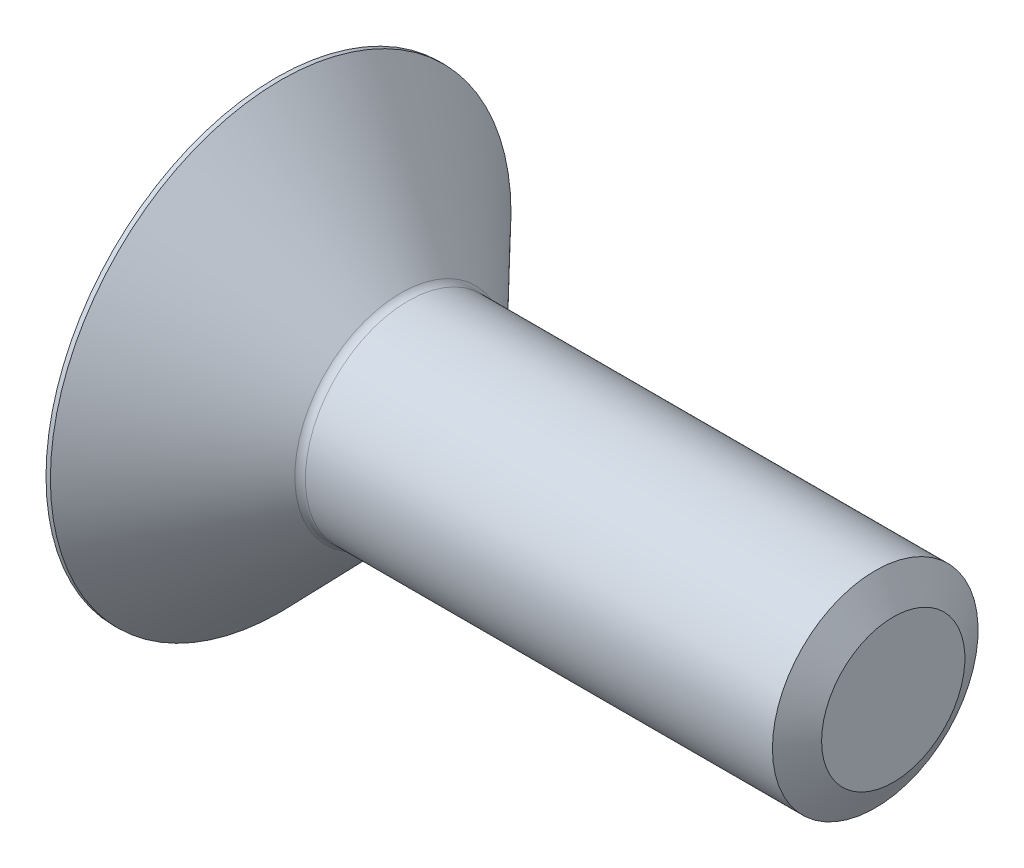
ISO-10303-21;
HEADER;
FILE_DESCRIPTION(('STEP AP214'),'2;1');
FILE_NAME('part.step','',(''),(''),'','','');
FILE_SCHEMA(('AUTOMOTIVE_DESIGN { 1 0 10303 214 1 1 1 1 }'));
ENDSEC;
DATA;
#1=APPLICATION_CONTEXT('core data for automotive mechanical design processes');
#2=APPLICATION_PROTOCOL_DEFINITION('international standard','automotive_design',2000,#1);
#3=PRODUCT_CONTEXT('',#1,'mechanical');
#4=PRODUCT('Part','Part','',(#3));
#5=PRODUCT_RELATED_PRODUCT_CATEGORY('part','',(#4));
#6=PRODUCT_DEFINITION_FORMATION('','',#4);
#7=PRODUCT_DEFINITION_CONTEXT('part definition',#1,'design');
#8=PRODUCT_DEFINITION('design','',#6,#7);
#9=PRODUCT_DEFINITION_SHAPE('','',#8);
#10=(LENGTH_UNIT() NAMED_UNIT(*) SI_UNIT(.MILLI.,.METRE.));
#11=(NAMED_UNIT(*) PLANE_ANGLE_UNIT() SI_UNIT($,.RADIAN.));
#12=(NAMED_UNIT(*) SI_UNIT($,.STERADIAN.) SOLID_ANGLE_UNIT());
#13=UNCERTAINTY_MEASURE_WITH_UNIT(LENGTH_MEASURE(1.E-05),#10,'distance_accuracy_value','');
#14=(GEOMETRIC_REPRESENTATION_CONTEXT(3) GLOBAL_UNCERTAINTY_ASSIGNED_CONTEXT((#13)) GLOBAL_UNIT_ASSIGNED_CONTEXT((#10,
#11,#12)) REPRESENTATION_CONTEXT('',''));
#15=CARTESIAN_POINT('',(0.,0.,0.));
#16=DIRECTION('',(0.,0.,1.));
#17=DIRECTION('',(1.,0.,0.));
#18=AXIS2_PLACEMENT_3D('',#15,#16,#17);
#19=CARTESIAN_POINT('',(0.,0.,0.));
#20=DIRECTION('',(1.,0.,0.));
#21=DIRECTION('',(0.,1.,0.));
#22=AXIS2_PLACEMENT_3D('',#19,#20,#21);
#23=CYLINDRICAL_SURFACE('',#22,2.);
#24=CARTESIAN_POINT('',(-9.43510503675808,0.,0.));
#25=DIRECTION('',(1.,0.,0.));
#26=DIRECTION('',(0.,1.,0.));
#27=AXIS2_PLACEMENT_3D('',#24,#25,#26);
#28=CIRCLE('',#27,2.);
#29=CARTESIAN_POINT('',(-9.43510503675808,2.,0.));
#30=VERTEX_POINT('',#29);
#31=EDGE_CURVE('E133',#30,#30,#28,.T.);
#32=ORIENTED_EDGE('',*,*,#31,.T.);
#33=EDGE_LOOP('',(#32));
#34=FACE_BOUND('',#33,.T.);
#35=CARTESIAN_POINT('',(-0.35,0.,0.));
#36=DIRECTION('',(-1.,0.,0.));
#37=DIRECTION('',(0.,0.,1.));
#38=AXIS2_PLACEMENT_3D('',#35,#36,#37);
#39=CIRCLE('',#38,2.);
#40=CARTESIAN_POINT('',(-0.35,0.,2.));
#41=VERTEX_POINT('',#40);
#42=EDGE_CURVE('E321',#41,#41,#39,.T.);
#43=ORIENTED_EDGE('',*,*,#42,.T.);
#44=EDGE_LOOP('',(#43));
#45=FACE_BOUND('',#44,.T.);
#46=ADVANCED_FACE('F46',(#34,#45),#23,.T.);
#47=CARTESIAN_POINT('',(-12.,4.48,0.));
#48=DIRECTION('',(-1.,0.,0.));
#49=DIRECTION('',(0.,-1.,0.));
#50=AXIS2_PLACEMENT_3D('',#47,#48,#49);
#51=PLANE('',#50);
#52=CARTESIAN_POINT('',(-12.,0.,0.));
#53=DIRECTION('',(1.,0.,0.));
#54=DIRECTION('',(0.,1.,0.));
#55=AXIS2_PLACEMENT_3D('',#52,#53,#54);
#56=CIRCLE('',#55,4.48);
#57=CARTESIAN_POINT('',(-12.,4.48,0.));
#58=VERTEX_POINT('',#57);
#59=EDGE_CURVE('E224',#58,#58,#56,.T.);
#60=ORIENTED_EDGE('',*,*,#59,.F.);
#61=EDGE_LOOP('',(#60));
#62=FACE_BOUND('',#61,.T.);
#63=CARTESIAN_POINT('',(-12.,0.,0.));
#64=DIRECTION('',(-1.,0.,0.));
#65=DIRECTION('',(0.,-1.,0.));
#66=AXIS2_PLACEMENT_3D('',#63,#64,#65);
#67=CIRCLE('',#66,1.44337567297406);
#68=CARTESIAN_POINT('',(-12.,-0.721687836487039,1.24999999999999));
#69=VERTEX_POINT('',#68);
#70=CARTESIAN_POINT('',(-12.,-1.44337567297406,0.));
#71=VERTEX_POINT('',#70);
#72=EDGE_CURVE('E50',#69,#71,#67,.F.);
#73=ORIENTED_EDGE('',*,*,#72,.T.);
#74=CARTESIAN_POINT('',(-12.,-0.721687836487038,-1.24999999999999));
#75=VERTEX_POINT('',#74);
#76=EDGE_CURVE('E11',#71,#75,#67,.F.);
#77=ORIENTED_EDGE('',*,*,#76,.T.);
#78=CARTESIAN_POINT('',(-12.,0.721687836487031,-1.25));
#79=VERTEX_POINT('',#78);
#80=EDGE_CURVE('E55',#75,#79,#67,.F.);
#81=ORIENTED_EDGE('',*,*,#80,.T.);
#82=CARTESIAN_POINT('',(-12.,1.44337567297406,0.));
#83=VERTEX_POINT('',#82);
#84=EDGE_CURVE('E120',#79,#83,#67,.F.);
#85=ORIENTED_EDGE('',*,*,#84,.T.);
#86=CARTESIAN_POINT('',(-12.,0.,0.));
#87=DIRECTION('',(-1.,0.,0.));
#88=DIRECTION('',(0.,0.,1.));
#89=AXIS2_PLACEMENT_3D('',#86,#87,#88);
#90=CIRCLE('',#89,1.44337567297406);
#91=CARTESIAN_POINT('',(-12.,0.721687836487035,1.25));
#92=VERTEX_POINT('',#91);
#93=EDGE_CURVE('E105',#92,#83,#90,.T.);
#94=ORIENTED_EDGE('',*,*,#93,.F.);
#95=EDGE_CURVE('E114',#92,#69,#67,.F.);
#96=ORIENTED_EDGE('',*,*,#95,.T.);
#97=EDGE_LOOP('',(#73,#77,#81,#85,#94,#96));
#98=FACE_BOUND('',#97,.T.);
#99=ADVANCED_FACE('F121',(#62,#98),#51,.T.);
#100=CARTESIAN_POINT('',(0.,0.,0.));
#101=DIRECTION('',(1.,0.,0.));
#102=DIRECTION('',(0.,1.,0.));
#103=AXIS2_PLACEMENT_3D('',#100,#101,#102);
#104=CYLINDRICAL_SURFACE('',#103,4.48);
#105=ORIENTED_EDGE('',*,*,#59,.T.);
#106=EDGE_LOOP('',(#105));
#107=FACE_BOUND('',#106,.T.);
#108=CARTESIAN_POINT('',(-11.9149081615215,0.,0.));
#109=DIRECTION('',(1.,0.,0.));
#110=DIRECTION('',(0.,1.,0.));
#111=AXIS2_PLACEMENT_3D('',#108,#109,#110);
#112=CIRCLE('',#111,4.48);
#113=CARTESIAN_POINT('',(-11.9149081615215,4.48,0.));
#114=VERTEX_POINT('',#113);
#115=EDGE_CURVE('E226',#114,#114,#112,.T.);
#116=ORIENTED_EDGE('',*,*,#115,.F.);
#117=EDGE_LOOP('',(#116));
#118=FACE_BOUND('',#117,.T.);
#119=ADVANCED_FACE('F212',(#107,#118),#104,.T.);
#120=CARTESIAN_POINT('',(-9.57897299682581,0.,0.));
#121=DIRECTION('',(-1.,0.,0.));
#122=DIRECTION('',(0.,-1.,0.));
#123=AXIS2_PLACEMENT_3D('',#120,#121,#122);
#124=CONICAL_SURFACE('',#123,2.0610683259082,0.802851455917393);
#125=ORIENTED_EDGE('',*,*,#115,.T.);
#126=EDGE_LOOP('',(#125));
#127=FACE_BOUND('',#126,.T.);
#128=CARTESIAN_POINT('',(-9.57897299682581,0.,0.));
#129=DIRECTION('',(1.,0.,0.));
#130=DIRECTION('',(0.,1.,0.));
#131=AXIS2_PLACEMENT_3D('',#128,#129,#130);
#132=CIRCLE('',#131,2.0610683259082);
#133=CARTESIAN_POINT('',(-9.57897299682581,2.0610683259082,0.));
#134=VERTEX_POINT('',#133);
#135=EDGE_CURVE('E230',#134,#134,#132,.T.);
#136=ORIENTED_EDGE('',*,*,#135,.F.);
#137=EDGE_LOOP('',(#136));
#138=FACE_BOUND('',#137,.T.);
#139=ADVANCED_FACE('F208',(#127,#138),#124,.T.);
#140=CARTESIAN_POINT('',(-9.43510503675808,0.,0.));
#141=DIRECTION('',(1.,0.,0.));
#142=DIRECTION('',(0.,1.,0.));
#143=AXIS2_PLACEMENT_3D('',#140,#141,#142);
#144=TOROIDAL_SURFACE('',#143,2.2,0.2);
#145=ORIENTED_EDGE('',*,*,#135,.T.);
#146=EDGE_LOOP('',(#145));
#147=FACE_BOUND('',#146,.T.);
#148=ORIENTED_EDGE('',*,*,#31,.F.);
#149=EDGE_LOOP('',(#148));
#150=FACE_BOUND('',#149,.T.);
#151=ADVANCED_FACE('F204',(#147,#150),#144,.F.);
#152=CARTESIAN_POINT('',(-11.63,0.,0.));
#153=DIRECTION('',(-1.,0.,0.));
#154=DIRECTION('',(0.,0.,1.));
#155=AXIS2_PLACEMENT_3D('',#152,#153,#154);
#156=CONICAL_SURFACE('',#155,0.,1.31985626102756);
#157=CARTESIAN_POINT('',(-12.0000296035517,-0.721572366433196,1.2502));
#158=CARTESIAN_POINT('',(-11.9923376245114,-0.751560236122212,1.19825948608787));
#159=CARTESIAN_POINT('',(-11.9853558988612,-0.781597955311095,1.14623263030924));
#160=CARTESIAN_POINT('',(-11.9730912390252,-0.841770545746217,1.04201064645257));
#161=CARTESIAN_POINT('',(-11.9678089341386,-0.871905448817343,0.989815463252219));
#162=CARTESIAN_POINT('',(-11.9592477971586,-0.932104975245321,0.885546824887376));
#163=CARTESIAN_POINT('',(-11.9559596086559,-0.962169257021961,0.833473961357168));
#164=CARTESIAN_POINT('',(-11.9515506008694,-1.0223329488635,0.729267390316703));
#165=CARTESIAN_POINT('',(-11.9504293994002,-1.05243235179703,0.677133695158351));
#166=CARTESIAN_POINT('',(-11.9504293994002,-1.11263115766407,0.572866304841648));
#167=CARTESIAN_POINT('',(-11.9515506008694,-1.1427305605976,0.520732609683296));
#168=CARTESIAN_POINT('',(-11.9559596086559,-1.20289425243914,0.416526038642831));
#169=CARTESIAN_POINT('',(-11.9592477971586,-1.23295853421578,0.364453175112623));
#170=CARTESIAN_POINT('',(-11.9678089341386,-1.29315806064376,0.26018453674778));
#171=CARTESIAN_POINT('',(-11.9730912390252,-1.32329296371488,0.207989353547427));
#172=CARTESIAN_POINT('',(-11.9853558988612,-1.38346555415,0.103767369690762));
#173=CARTESIAN_POINT('',(-11.9923376245114,-1.41350327333889,0.0517405139121311));
#174=CARTESIAN_POINT('',(-12.0000296035517,-1.4434911430279,-0.000200000000000636));
#175=B_SPLINE_CURVE_WITH_KNOTS('',3,(#157,#158,#159,#160,#161,#162,#163,#164,#165,#166,#167,
#168,#169,#170,#171,#172,#173,#174),.UNSPECIFIED.,.F.,.F.,(4,2,2,2,2,2,2,2,4),(0.,
0.181409592460798,0.362886284169927,0.543504761741732,0.724091381228727,0.904678000715721,
1.08529647828753,1.26677316999666,1.44818276245745),.UNSPECIFIED.);
#176=EDGE_CURVE('E139',#69,#71,#175,.T.);
#177=ORIENTED_EDGE('',*,*,#176,.T.);
#178=ORIENTED_EDGE('',*,*,#72,.F.);
#179=EDGE_LOOP('',(#177,#178));
#180=FACE_BOUND('',#179,.T.);
#181=ADVANCED_FACE('F207',(#180),#156,.F.);
#182=CARTESIAN_POINT('',(-12.2099346759608,-1.88564456120835,1.25));
#183=CARTESIAN_POINT('',(-12.1978717207745,-1.82917708754349,1.25));
#184=CARTESIAN_POINT('',(-12.1859628504096,-1.77267667269393,1.25));
#185=CARTESIAN_POINT('',(-12.1625309817601,-1.65959353764961,1.25));
#186=CARTESIAN_POINT('',(-12.1510079994722,-1.603010814144,1.25));
#187=CARTESIAN_POINT('',(-12.1171150456129,-1.43301680264336,1.25));
#188=CARTESIAN_POINT('',(-12.0954436732374,-1.31946408431674,1.25));
#189=CARTESIAN_POINT('',(-12.0550957638615,-1.09274070828191,1.25));
#190=CARTESIAN_POINT('',(-12.0363969731699,-0.979574090955366,1.25));
#191=CARTESIAN_POINT('',(-12.003262336561,-0.752620098792875,1.25));
#192=CARTESIAN_POINT('',(-11.9888257054665,-0.638832842230004,1.25));
#193=CARTESIAN_POINT('',(-11.9660896767951,-0.409425109562639,1.25));
#194=CARTESIAN_POINT('',(-11.9578544497048,-0.293797778272156,1.25));
#195=CARTESIAN_POINT('',(-11.9515679025367,-0.120164512833949,1.25));
#196=CARTESIAN_POINT('',(-11.9504831645204,-0.0622627928260231,1.25));
#197=CARTESIAN_POINT('',(-11.9503795328626,0.0535425644189861,1.25));
#198=CARTESIAN_POINT('',(-11.9513606413614,0.111446201657993,1.25));
#199=CARTESIAN_POINT('',(-11.9573598650352,0.285474295690509,1.25));
#200=CARTESIAN_POINT('',(-11.9654487463716,0.401498867422989,1.25));
#201=CARTESIAN_POINT('',(-11.9881044285232,0.632939913681974,1.25));
#202=CARTESIAN_POINT('',(-12.0026754362916,0.748355943957415,1.25));
#203=CARTESIAN_POINT('',(-12.0365518645555,0.980878548477109,1.25));
#204=CARTESIAN_POINT('',(-12.0559479394114,1.09797147883435,1.25));
#205=CARTESIAN_POINT('',(-12.0976947052346,1.33163516367125,1.25));
#206=CARTESIAN_POINT('',(-12.1200458280615,1.44820583924764,1.25));
#207=CARTESIAN_POINT('',(-12.1666691464839,1.68099121651053,1.25));
#208=CARTESIAN_POINT('',(-12.1909418646661,1.79720581237231,1.25));
#209=CARTESIAN_POINT('',(-12.2407644332383,2.02936144868274,1.25));
#210=CARTESIAN_POINT('',(-12.2663143094632,2.14530248354797,1.25));
#211=CARTESIAN_POINT('',(-12.3180065719477,2.37571314645443,1.25));
#212=CARTESIAN_POINT('',(-12.3441393559828,2.4901849375717,1.25));
#213=CARTESIAN_POINT('',(-12.3970181249437,2.71898894145419,1.25));
#214=CARTESIAN_POINT('',(-12.4237641225597,2.83332115127916,1.25));
#215=CARTESIAN_POINT('',(-12.4776683131006,3.06173187878166,1.25));
#216=CARTESIAN_POINT('',(-12.504825927525,3.17581053326541,1.25));
#217=CARTESIAN_POINT('',(-12.5594820608739,3.40388218756383,1.25));
#218=CARTESIAN_POINT('',(-12.5869805684218,3.51787519010305,1.25));
#219=CARTESIAN_POINT('',(-12.6145979060459,3.6318390658806,1.25));
#220=B_SPLINE_CURVE_WITH_KNOTS('',3,(#182,#183,#184,#185,#186,#187,#188,#189,#190,#191,#192,
#193,#194,#195,#196,#197,#198,#199,#200,#201,#202,#203,#204,#205,#206,#207,#208,#209,#210,#211,
#212,#213,#214,#215,#216,#217,#218,#219),.UNSPECIFIED.,.F.,.F.,(4,2,2,2,2,2,2,2,2,2,2,2,2,2,2,2,
2,2,4),(0.,0.173224299011892,0.346455770052937,0.693239171255751,1.03728991151599,
1.38127723097017,1.72877689620779,1.90247833758137,2.07617995891236,2.42483219762295,
2.77371104535804,3.12971850172323,3.48577804372492,3.84193475261371,4.19809866891608,
4.55034691732847,4.90260246198638,5.25440194267348,5.60618971410929),.UNSPECIFIED.);
#221=EDGE_CURVE('E110',#92,#69,#220,.F.);
#222=ORIENTED_EDGE('',*,*,#221,.T.);
#223=ORIENTED_EDGE('',*,*,#95,.F.);
#224=EDGE_LOOP('',(#222,#223));
#225=FACE_BOUND('',#224,.T.);
#226=ADVANCED_FACE('F115',(#225),#156,.F.);
#227=CARTESIAN_POINT('',(-12.0000296035517,1.4434911430279,-0.000199999999999889));
#228=CARTESIAN_POINT('',(-11.9923376245114,1.41350327333888,0.0517405139121313));
#229=CARTESIAN_POINT('',(-11.9853558988612,1.38346555415,0.103767369690762));
#230=CARTESIAN_POINT('',(-11.9730912390252,1.32329296371488,0.207989353547427));
#231=CARTESIAN_POINT('',(-11.9678089341386,1.29315806064375,0.260184536747781));
#232=CARTESIAN_POINT('',(-11.9592477971586,1.23295853421578,0.364453175112623));
#233=CARTESIAN_POINT('',(-11.9559596086559,1.20289425243914,0.416526038642832));
#234=CARTESIAN_POINT('',(-11.9515506008694,1.1427305605976,0.520732609683297));
#235=CARTESIAN_POINT('',(-11.9504293994002,1.11263115766407,0.572866304841648));
#236=CARTESIAN_POINT('',(-11.9504293994002,1.05243235179702,0.677133695158351));
#237=CARTESIAN_POINT('',(-11.9515506008694,1.0223329488635,0.729267390316703));
#238=CARTESIAN_POINT('',(-11.9559596086559,0.962169257021958,0.833473961357168));
#239=CARTESIAN_POINT('',(-11.9592477971586,0.932104975245318,0.885546824887376));
#240=CARTESIAN_POINT('',(-11.9678089341386,0.87190544881734,0.989815463252219));
#241=CARTESIAN_POINT('',(-11.9730912390252,0.841770545746214,1.04201064645257));
#242=CARTESIAN_POINT('',(-11.9853558988612,0.781597955311092,1.14623263030924));
#243=CARTESIAN_POINT('',(-11.9923376245114,0.75156023612221,1.19825948608787));
#244=CARTESIAN_POINT('',(-12.0000296035517,0.721572366433193,1.2502));
#245=B_SPLINE_CURVE_WITH_KNOTS('',3,(#227,#228,#229,#230,#231,#232,#233,#234,#235,#236,#237,
#238,#239,#240,#241,#242,#243,#244),.UNSPECIFIED.,.F.,.F.,(4,2,2,2,2,2,2,2,4),(0.,
0.181409592460797,0.362886284169927,0.543504761741732,0.724091381228726,0.904678000715721,
1.08529647828753,1.26677316999666,1.44818276245745),.UNSPECIFIED.);
#246=EDGE_CURVE('E101',#83,#92,#245,.T.);
#247=ORIENTED_EDGE('',*,*,#246,.T.);
#248=ORIENTED_EDGE('',*,*,#93,.T.);
#249=EDGE_LOOP('',(#247,#248));
#250=FACE_BOUND('',#249,.T.);
#251=ADVANCED_FACE('F103',(#250),#156,.F.);
#252=CARTESIAN_POINT('',(-12.0000296035517,0.721572366433193,-1.2502));
#253=CARTESIAN_POINT('',(-11.9923376245114,0.75156023612221,-1.19825948608787));
#254=CARTESIAN_POINT('',(-11.9853558988612,0.781597955311092,-1.14623263030924));
#255=CARTESIAN_POINT('',(-11.9730912390252,0.841770545746214,-1.04201064645257));
#256=CARTESIAN_POINT('',(-11.9678089341386,0.87190544881734,-0.989815463252219));
#257=CARTESIAN_POINT('',(-11.9592477971586,0.932104975245318,-0.885546824887376));
#258=CARTESIAN_POINT('',(-11.9559596086559,0.962169257021958,-0.833473961357168));
#259=CARTESIAN_POINT('',(-11.9515506008694,1.0223329488635,-0.729267390316703));
#260=CARTESIAN_POINT('',(-11.9504293994002,1.05243235179702,-0.677133695158352));
#261=CARTESIAN_POINT('',(-11.9504293994002,1.11263115766407,-0.572866304841648));
#262=CARTESIAN_POINT('',(-11.9515506008694,1.1427305605976,-0.520732609683297));
#263=CARTESIAN_POINT('',(-11.9559596086559,1.20289425243914,-0.416526038642832));
#264=CARTESIAN_POINT('',(-11.9592477971586,1.23295853421578,-0.364453175112624));
#265=CARTESIAN_POINT('',(-11.9678089341386,1.29315806064375,-0.260184536747781));
#266=CARTESIAN_POINT('',(-11.9730912390252,1.32329296371488,-0.207989353547427));
#267=CARTESIAN_POINT('',(-11.9853558988612,1.38346555415,-0.103767369690762));
#268=CARTESIAN_POINT('',(-11.9923376245114,1.41350327333888,-0.0517405139121312));
#269=CARTESIAN_POINT('',(-12.0000296035517,1.4434911430279,0.000200000000000081));
#270=B_SPLINE_CURVE_WITH_KNOTS('',3,(#252,#253,#254,#255,#256,#257,#258,#259,#260,#261,#262,
#263,#264,#265,#266,#267,#268,#269),.UNSPECIFIED.,.F.,.F.,(4,2,2,2,2,2,2,2,4),(0.,
0.181409592460797,0.362886284169927,0.543504761741732,0.724091381228727,0.904678000715721,
1.08529647828753,1.26677316999666,1.44818276245745),.UNSPECIFIED.);
#271=EDGE_CURVE('E123',#79,#83,#270,.T.);
#272=ORIENTED_EDGE('',*,*,#271,.T.);
#273=ORIENTED_EDGE('',*,*,#84,.F.);
#274=EDGE_LOOP('',(#272,#273));
#275=FACE_BOUND('',#274,.T.);
#276=ADVANCED_FACE('F304',(#275),#156,.F.);
#277=CARTESIAN_POINT('',(-12.2099346759325,-1.885644561076,-1.25));
#278=CARTESIAN_POINT('',(-12.1978717207476,-1.82917708741649,-1.25));
#279=CARTESIAN_POINT('',(-12.1859628503841,-1.7726766725723,-1.25));
#280=CARTESIAN_POINT('',(-12.1625309817374,-1.65959353753871,-1.25));
#281=CARTESIAN_POINT('',(-12.1510079994509,-1.60301081403847,-1.25));
#282=CARTESIAN_POINT('',(-12.1171150455956,-1.43301680255399,-1.25));
#283=CARTESIAN_POINT('',(-12.0954436732229,-1.31946408423816,-1.25));
#284=CARTESIAN_POINT('',(-12.0550957638519,-1.09274070822473,-1.25));
#285=CARTESIAN_POINT('',(-12.0363969731627,-0.97957409090879,-1.25));
#286=CARTESIAN_POINT('',(-12.0032623365578,-0.752620098767597,-1.25));
#287=CARTESIAN_POINT('',(-11.988825705465,-0.638832842215426,-1.25));
#288=CARTESIAN_POINT('',(-11.9660896767959,-0.409425109570647,-1.25));
#289=CARTESIAN_POINT('',(-11.9578544497063,-0.293797778292056,-1.25));
#290=CARTESIAN_POINT('',(-11.9515679025377,-0.120164512871692,-1.25));
#291=CARTESIAN_POINT('',(-11.950483164521,-0.0622627928697106,-1.25));
#292=CARTESIAN_POINT('',(-11.9503795328621,0.0535425643634282,-1.25));
#293=CARTESIAN_POINT('',(-11.9513606413601,0.11144620159651,-1.25));
#294=CARTESIAN_POINT('',(-11.9573598650309,0.285474295611227,-1.25));
#295=CARTESIAN_POINT('',(-11.9654487463646,0.401498867331896,-1.25));
#296=CARTESIAN_POINT('',(-11.9881044285101,0.632939913567422,-1.25));
#297=CARTESIAN_POINT('',(-12.0026754362751,0.748355943831214,-1.25));
#298=CARTESIAN_POINT('',(-12.0365518645336,0.980878548339565,-1.25));
#299=CARTESIAN_POINT('',(-12.0559479393881,1.09797147869704,-1.25));
#300=CARTESIAN_POINT('',(-12.097694705209,1.33163516353436,-1.25));
#301=CARTESIAN_POINT('',(-12.1200458280349,1.44820583911091,-1.25));
#302=CARTESIAN_POINT('',(-12.1666691464558,1.68099121637416,-1.25));
#303=CARTESIAN_POINT('',(-12.1909418646374,1.79720581223611,-1.25));
#304=CARTESIAN_POINT('',(-12.2407644332086,2.02936144854685,-1.25));
#305=CARTESIAN_POINT('',(-12.2663143094331,2.14530248341221,-1.25));
#306=CARTESIAN_POINT('',(-12.318006571917,2.37571314631909,-1.25));
#307=CARTESIAN_POINT('',(-12.3441393559518,2.49018493743663,-1.25));
#308=CARTESIAN_POINT('',(-12.3970181249123,2.71898894131965,-1.25));
#309=CARTESIAN_POINT('',(-12.4237641225282,2.83332115114489,-1.25));
#310=CARTESIAN_POINT('',(-12.4776683130688,3.06173187864781,-1.25));
#311=CARTESIAN_POINT('',(-12.5048259274931,3.17581053313172,-1.25));
#312=CARTESIAN_POINT('',(-12.5594820608418,3.40388218743046,-1.25));
#313=CARTESIAN_POINT('',(-12.5869805683896,3.51787518996983,-1.25));
#314=CARTESIAN_POINT('',(-12.6145979060137,3.63183906574753,-1.25));
#315=B_SPLINE_CURVE_WITH_KNOTS('',3,(#277,#278,#279,#280,#281,#282,#283,#284,#285,#286,#287,
#288,#289,#290,#291,#292,#293,#294,#295,#296,#297,#298,#299,#300,#301,#302,#303,#304,#305,#306,
#307,#308,#309,#310,#311,#312,#313,#314),.UNSPECIFIED.,.F.,.F.,(4,2,2,2,2,2,2,2,2,2,2,2,2,2,2,2,
2,2,4),(0.,0.173224298995286,0.346455770019722,0.693239171189212,1.03728991141696,
1.38127723083866,1.72877689604066,1.90247833739643,2.07617995870963,2.42483219738435,
2.77371104508349,3.12971850144865,3.48577804345034,3.84193475233927,4.19809866864177,
4.55034691705482,4.90260246171338,5.25440194240087,5.60618971383707),.UNSPECIFIED.);
#316=EDGE_CURVE('E260',#75,#79,#315,.T.);
#317=ORIENTED_EDGE('',*,*,#316,.T.);
#318=ORIENTED_EDGE('',*,*,#80,.F.);
#319=EDGE_LOOP('',(#317,#318));
#320=FACE_BOUND('',#319,.T.);
#321=ADVANCED_FACE('F292',(#320),#156,.F.);
#322=CARTESIAN_POINT('',(-12.0000296035517,-1.4434911430279,0.00019999999999943));
#323=CARTESIAN_POINT('',(-11.9923376245114,-1.41350327333889,-0.0517405139121319));
#324=CARTESIAN_POINT('',(-11.9853558988612,-1.38346555415,-0.103767369690763));
#325=CARTESIAN_POINT('',(-11.9730912390252,-1.32329296371488,-0.207989353547427));
#326=CARTESIAN_POINT('',(-11.9678089341386,-1.29315806064376,-0.260184536747781));
#327=CARTESIAN_POINT('',(-11.9592477971586,-1.23295853421578,-0.364453175112624));
#328=CARTESIAN_POINT('',(-11.9559596086559,-1.20289425243914,-0.416526038642832));
#329=CARTESIAN_POINT('',(-11.9515506008694,-1.1427305605976,-0.520732609683297));
#330=CARTESIAN_POINT('',(-11.9504293994002,-1.11263115766407,-0.572866304841649));
#331=CARTESIAN_POINT('',(-11.9504293994002,-1.05243235179703,-0.677133695158352));
#332=CARTESIAN_POINT('',(-11.9515506008694,-1.0223329488635,-0.729267390316703));
#333=CARTESIAN_POINT('',(-11.9559596086559,-0.962169257021961,-0.833473961357168));
#334=CARTESIAN_POINT('',(-11.9592477971586,-0.932104975245321,-0.885546824887376));
#335=CARTESIAN_POINT('',(-11.9678089341386,-0.871905448817343,-0.989815463252219));
#336=CARTESIAN_POINT('',(-11.9730912390252,-0.841770545746217,-1.04201064645257));
#337=CARTESIAN_POINT('',(-11.9853558988612,-0.781597955311095,-1.14623263030924));
#338=CARTESIAN_POINT('',(-11.9923376245114,-0.751560236122212,-1.19825948608787));
#339=CARTESIAN_POINT('',(-12.0000296035517,-0.721572366433196,-1.2502));
#340=B_SPLINE_CURVE_WITH_KNOTS('',3,(#322,#323,#324,#325,#326,#327,#328,#329,#330,#331,#332,
#333,#334,#335,#336,#337,#338,#339),.UNSPECIFIED.,.F.,.F.,(4,2,2,2,2,2,2,2,4),(0.,
0.181409592460797,0.362886284169926,0.543504761741732,0.724091381228726,0.90467800071572,
1.08529647828753,1.26677316999665,1.44818276245745),.UNSPECIFIED.);
#341=EDGE_CURVE('E141',#71,#75,#340,.T.);
#342=ORIENTED_EDGE('',*,*,#341,.T.);
#343=ORIENTED_EDGE('',*,*,#76,.F.);
#344=EDGE_LOOP('',(#342,#343));
#345=FACE_BOUND('',#344,.T.);
#346=ADVANCED_FACE('F294',(#345),#156,.F.);
#347=CARTESIAN_POINT('',(-10.5,0.,0.));
#348=DIRECTION('',(-1.,0.,0.));
#349=DIRECTION('',(0.,0.,1.));
#350=AXIS2_PLACEMENT_3D('',#347,#348,#349);
#351=CONICAL_SURFACE('',#350,1.44337567297406,1.0471975511966);
#352=CARTESIAN_POINT('',(-9.66666666666668,0.,0.));
#353=VERTEX_POINT('',#352);
#354=VERTEX_LOOP('',#353);
#355=FACE_BOUND('',#354,.T.);
#356=CARTESIAN_POINT('',(-10.9647941112469,-1.86893140246438,1.25));
#357=CARTESIAN_POINT('',(-10.9388968387752,-1.81495202331948,1.25));
#358=CARTESIAN_POINT('',(-10.913268622226,-1.76084125406821,1.25));
#359=CARTESIAN_POINT('',(-10.8627027608805,-1.65228662710084,1.25));
#360=CARTESIAN_POINT('',(-10.8377652403636,-1.59784271156478,1.25));
#361=CARTESIAN_POINT('',(-10.7885939165755,-1.48823931743727,1.25));
#362=CARTESIAN_POINT('',(-10.7643652996986,-1.43307750157608,1.25));
#363=CARTESIAN_POINT('',(-10.7169950706884,-1.322291884876,1.25));
#364=CARTESIAN_POINT('',(-10.6938534020354,-1.26666810823571,1.25));
#365=CARTESIAN_POINT('',(-10.6483546132115,-1.15340083084339,1.25));
#366=CARTESIAN_POINT('',(-10.6260338155954,-1.09574254299337,1.25));
#367=CARTESIAN_POINT('',(-10.5832554770157,-0.979741083181771,1.25));
#368=CARTESIAN_POINT('',(-10.5627981695306,-0.921397826430708,1.25));
#369=CARTESIAN_POINT('',(-10.5050842377309,-0.745435524961061,1.25));
#370=CARTESIAN_POINT('',(-10.47135021501,-0.626561938268991,1.25));
#371=CARTESIAN_POINT('',(-10.4322204068367,-0.445873083728397,1.25));
#372=CARTESIAN_POINT('',(-10.42109406062,-0.385304700204766,1.25));
#373=CARTESIAN_POINT('',(-10.4034278522596,-0.263486592005966,1.25));
#374=CARTESIAN_POINT('',(-10.3968876801734,-0.202236913658281,1.25));
#375=CARTESIAN_POINT('',(-10.3889987810357,-0.0801324467114857,1.25));
#376=CARTESIAN_POINT('',(-10.3875887912554,-0.0192817195873881,1.25));
#377=CARTESIAN_POINT('',(-10.389916187898,0.102319232972277,1.25));
#378=CARTESIAN_POINT('',(-10.3936538930481,0.163069451951552,1.25));
#379=CARTESIAN_POINT('',(-10.4088980280863,0.312961599284804,1.25));
#380=CARTESIAN_POINT('',(-10.4232612484972,0.401813056011363,1.25));
#381=CARTESIAN_POINT('',(-10.4602998496175,0.577788147007398,1.25));
#382=CARTESIAN_POINT('',(-10.4829852484746,0.664909564874818,1.25));
#383=CARTESIAN_POINT('',(-10.521737453429,0.795209225202643,1.25));
#384=CARTESIAN_POINT('',(-10.535622944966,0.839061002297504,1.25));
#385=CARTESIAN_POINT('',(-10.5646784155354,0.926308087978065,1.25));
#386=CARTESIAN_POINT('',(-10.5798475929484,0.969703662686594,1.25));
#387=CARTESIAN_POINT('',(-10.6112501341956,1.05609633562206,1.25));
#388=CARTESIAN_POINT('',(-10.6274833046304,1.09909350465343,1.25));
#389=CARTESIAN_POINT('',(-10.6608382441348,1.18474903966884,1.25));
#390=CARTESIAN_POINT('',(-10.6779601633366,1.22740734699801,1.25));
#391=CARTESIAN_POINT('',(-10.7227614294772,1.33629459608889,1.25));
#392=CARTESIAN_POINT('',(-10.7509693838226,1.40230581149779,1.25));
#393=CARTESIAN_POINT('',(-10.8087450814145,1.53373213651375,1.25));
#394=CARTESIAN_POINT('',(-10.8383129265288,1.59914720102263,1.25));
#395=CARTESIAN_POINT('',(-10.9285769202908,1.7946968045205,1.25));
#396=CARTESIAN_POINT('',(-10.990824273455,1.92411391038016,1.25));
#397=CARTESIAN_POINT('',(-11.1179296231775,2.18184246931719,1.25));
#398=CARTESIAN_POINT('',(-11.1827907350414,2.31015236758041,1.25));
#399=CARTESIAN_POINT('',(-11.31418074581,2.56589305739078,1.25));
#400=CARTESIAN_POINT('',(-11.3807094327218,2.69332395808158,1.25));
#401=CARTESIAN_POINT('',(-11.5085820019272,2.93557826354771,1.25));
#402=CARTESIAN_POINT('',(-11.5698225706953,3.05045639166053,1.25));
#403=CARTESIAN_POINT('',(-11.6930014803272,3.27984311951902,1.25));
#404=CARTESIAN_POINT('',(-11.7549398470138,3.39435170538628,1.25));
#405=CARTESIAN_POINT('',(-11.8791811563467,3.62279327925392,1.25));
#406=CARTESIAN_POINT('',(-11.9414827709679,3.7367269904863,1.25));
#407=CARTESIAN_POINT('',(-12.0664914922261,3.96436406683005,1.25));
#408=CARTESIAN_POINT('',(-12.1291985774721,4.07806744368399,1.25));
#409=CARTESIAN_POINT('',(-12.1920543496595,4.19168806666669,1.25));
#410=B_SPLINE_CURVE_WITH_KNOTS('',3,(#356,#357,#358,#359,#360,#361,#362,#363,#364,#365,#366,
#367,#368,#369,#370,#371,#372,#373,#374,#375,#376,#377,#378,#379,#380,#381,#382,#383,#384,#385,
#386,#387,#388,#389,#390,#391,#392,#393,#394,#395,#396,#397,#398,#399,#400,#401,#402,#403,#404,
#405,#406,#407,#408,#409),.UNSPECIFIED.,.F.,.F.,(4,2,2,2,2,2,2,2,2,2,2,2,2,2,2,2,2,2,2,2,2,2,2,
2,2,2,4),(0.,0.179612926792688,0.359257964740983,0.539992735858538,0.720718098634108,
0.906167782291709,1.09164066925558,1.46154014687423,1.64614554490065,1.83073846573361,
2.01311967500085,2.19551217717958,2.46497297803791,2.73475922301,2.87273702449913,
3.01062929039678,3.14849656109657,3.28638719734752,3.50172172684185,3.71707241315527,
4.14784491485955,4.57914698421607,5.01039449901239,5.40093821275166,5.79149642681542,
6.18106124320223,6.57060567267797),.UNSPECIFIED.);
#411=CARTESIAN_POINT('',(-10.5,-0.721687836487034,1.25));
#412=VERTEX_POINT('',#411);
#413=CARTESIAN_POINT('',(-10.5,0.721687836487031,1.25));
#414=VERTEX_POINT('',#413);
#415=EDGE_CURVE('E173',#412,#414,#410,.T.);
#416=ORIENTED_EDGE('',*,*,#415,.T.);
#417=CARTESIAN_POINT('',(-10.500066674666,0.721572366433193,1.2502));
#418=CARTESIAN_POINT('',(-10.4817459147637,0.753288124996229,1.19526669476823));
#419=CARTESIAN_POINT('',(-10.4650833062006,0.785277649221702,1.13985921349976));
#420=CARTESIAN_POINT('',(-10.4359973039458,0.849810733708402,1.02808463239966));
#421=CARTESIAN_POINT('',(-10.4235842019761,0.882355441401181,0.97171554515829));
#422=CARTESIAN_POINT('',(-10.404259687636,0.947041487997316,0.859676025913016));
#423=CARTESIAN_POINT('',(-10.3972196894474,0.979172868975892,0.804022841540771));
#424=CARTESIAN_POINT('',(-10.3888124326306,1.04358696985655,0.692454346091609));
#425=CARTESIAN_POINT('',(-10.3874382152047,1.07586945532687,0.6365394410624));
#426=CARTESIAN_POINT('',(-10.3902833373679,1.13620103554812,0.532042078818275));
#427=CARTESIAN_POINT('',(-10.39380409882,1.16425912049992,0.483444050118685));
#428=CARTESIAN_POINT('',(-10.4049671126993,1.22019247526559,0.386564637826762));
#429=CARTESIAN_POINT('',(-10.4126131855727,1.24806755133608,0.338283589807837));
#430=CARTESIAN_POINT('',(-10.4317294547005,1.30411641158755,0.241204116145958));
#431=CARTESIAN_POINT('',(-10.4432807569797,1.33228309485381,0.192417989648101));
#432=CARTESIAN_POINT('',(-10.4694983146939,1.38819614400745,0.0955737477078984));
#433=CARTESIAN_POINT('',(-10.4841584021391,1.41594322730596,0.047514389673036));
#434=CARTESIAN_POINT('',(-10.500066674666,1.4434911430279,-0.000199999999999954));
#435=B_SPLINE_CURVE_WITH_KNOTS('',3,(#417,#418,#419,#420,#421,#422,#423,#424,#425,#426,#427,
#428,#429,#430,#431,#432,#433,#434),.UNSPECIFIED.,.F.,.F.,(4,2,2,2,2,2,2,2,4),(0.,
0.198150821029559,0.396778196315221,0.590488617354399,0.783961049317181,0.952480056398646,
1.1211553973001,1.2935743034359,1.4656542697693),.UNSPECIFIED.);
#436=CARTESIAN_POINT('',(-10.5,1.44337567297406,0.));
#437=VERTEX_POINT('',#436);
#438=EDGE_CURVE('E130',#414,#437,#435,.T.);
#439=ORIENTED_EDGE('',*,*,#438,.T.);
#440=CARTESIAN_POINT('',(-10.500066674666,1.4434911430279,0.000200000000000111));
#441=CARTESIAN_POINT('',(-10.4817459147637,1.41177538446487,-0.0547333052317649));
#442=CARTESIAN_POINT('',(-10.4650833062006,1.37978586023939,-0.110140786500239));
#443=CARTESIAN_POINT('',(-10.4359973039458,1.31525277575269,-0.22191536760034));
#444=CARTESIAN_POINT('',(-10.4235842019761,1.28270806805991,-0.27828445484171));
#445=CARTESIAN_POINT('',(-10.404259687636,1.21802202146378,-0.390323974086984));
#446=CARTESIAN_POINT('',(-10.3972196894474,1.1858906404852,-0.445977158459229));
#447=CARTESIAN_POINT('',(-10.3888124326306,1.12147653960455,-0.557545653908391));
#448=CARTESIAN_POINT('',(-10.3874382152047,1.08919405413422,-0.6134605589376));
#449=CARTESIAN_POINT('',(-10.3902833373679,1.02886247391297,-0.717957921181725));
#450=CARTESIAN_POINT('',(-10.39380409882,1.00080438896118,-0.766555949881315));
#451=CARTESIAN_POINT('',(-10.4049671126993,0.944871034195502,-0.863435362173238));
#452=CARTESIAN_POINT('',(-10.4126131855727,0.916995958125019,-0.911716410192163));
#453=CARTESIAN_POINT('',(-10.4317294547005,0.860947097873545,-1.00879588385404));
#454=CARTESIAN_POINT('',(-10.4432807569797,0.832780414607289,-1.0575820103519));
#455=CARTESIAN_POINT('',(-10.4694983146939,0.776867365453647,-1.1544262522921));
#456=CARTESIAN_POINT('',(-10.4841584021391,0.749120282155139,-1.20248561032696));
#457=CARTESIAN_POINT('',(-10.500066674666,0.721572366433193,-1.2502));
#458=B_SPLINE_CURVE_WITH_KNOTS('',3,(#440,#441,#442,#443,#444,#445,#446,#447,#448,#449,#450,
#451,#452,#453,#454,#455,#456,#457),.UNSPECIFIED.,.F.,.F.,(4,2,2,2,2,2,2,2,4),(0.,
0.198150821029559,0.396778196315221,0.590488617354399,0.783961049317181,0.952480056398646,
1.1211553973001,1.2935743034359,1.4656542697693),.UNSPECIFIED.);
#459=CARTESIAN_POINT('',(-10.5,0.721687836487033,-1.25));
#460=VERTEX_POINT('',#459);
#461=EDGE_CURVE('E225',#437,#460,#458,.T.);
#462=ORIENTED_EDGE('',*,*,#461,.T.);
#463=CARTESIAN_POINT('',(-10.9647941109243,-1.86893140179217,-1.25));
#464=CARTESIAN_POINT('',(-10.9388968384665,-1.81495202267025,-1.25));
#465=CARTESIAN_POINT('',(-10.9132686219312,-1.76084125344197,-1.25));
#466=CARTESIAN_POINT('',(-10.8627027606134,-1.65228662652066,-1.25));
#467=CARTESIAN_POINT('',(-10.8377652401103,-1.59784271100767,-1.25));
#468=CARTESIAN_POINT('',(-10.7885939163498,-1.48823931692675,-1.25));
#469=CARTESIAN_POINT('',(-10.7643652994868,-1.43307750108907,-1.25));
#470=CARTESIAN_POINT('',(-10.7169950705039,-1.32229188443621,-1.25));
#471=CARTESIAN_POINT('',(-10.6938534018645,-1.26666810781962,-1.25));
#472=CARTESIAN_POINT('',(-10.6483546130678,-1.15340083047608,-1.25));
#473=CARTESIAN_POINT('',(-10.6260338154653,-1.09574254265115,-1.25));
#474=CARTESIAN_POINT('',(-10.583255476912,-0.979741082890175,-1.25));
#475=CARTESIAN_POINT('',(-10.5627981694397,-0.921397826164638,-1.25));
#476=CARTESIAN_POINT('',(-10.5050842376762,-0.74543552477224,-1.25));
#477=CARTESIAN_POINT('',(-10.4713502149769,-0.626561938132859,-1.25));
#478=CARTESIAN_POINT('',(-10.4322204068282,-0.445873083681238,-1.25));
#479=CARTESIAN_POINT('',(-10.4210940606189,-0.385304700192767,-1.25));
#480=CARTESIAN_POINT('',(-10.4034278522676,-0.26348659206503,-1.25));
#481=CARTESIAN_POINT('',(-10.3968876801832,-0.202236913753246,-1.25));
#482=CARTESIAN_POINT('',(-10.3889987810428,-0.0801324468775844,-1.25));
#483=CARTESIAN_POINT('',(-10.3875887912582,-0.0192817197887162,-1.25));
#484=CARTESIAN_POINT('',(-10.3899161878862,0.102319232701152,-1.25));
#485=CARTESIAN_POINT('',(-10.3936538930261,0.16306945164586,-1.25));
#486=CARTESIAN_POINT('',(-10.4088980280361,0.312961598922924,-1.25));
#487=CARTESIAN_POINT('',(-10.4232612484297,0.40181305562826,-1.25));
#488=CARTESIAN_POINT('',(-10.4602998495149,0.577788146583199,-1.25));
#489=CARTESIAN_POINT('',(-10.4829852483542,0.66490956443075,-1.25));
#490=CARTESIAN_POINT('',(-10.5217374532821,0.795209224728794,-1.25));
#491=CARTESIAN_POINT('',(-10.5356229448103,0.839061001813536,-1.25));
#492=CARTESIAN_POINT('',(-10.5646784153621,0.926308087473956,-1.25));
#493=CARTESIAN_POINT('',(-10.5798475927664,0.969703662172462,-1.25));
#494=CARTESIAN_POINT('',(-10.6112501339966,1.05609633508794,-1.25));
#495=CARTESIAN_POINT('',(-10.627483304423,1.09909350410934,-1.25));
#496=CARTESIAN_POINT('',(-10.6608382439108,1.1847490391048,-1.25));
#497=CARTESIAN_POINT('',(-10.6779601631043,1.22740734642399,-1.25));
#498=CARTESIAN_POINT('',(-10.7227614292321,1.33629459550825,-1.25));
#499=CARTESIAN_POINT('',(-10.7509693835735,1.40230581092029,-1.25));
#500=CARTESIAN_POINT('',(-10.8087450811585,1.53373213594212,-1.25));
#501=CARTESIAN_POINT('',(-10.8383129262699,1.59914720045375,-1.25));
#502=CARTESIAN_POINT('',(-10.9285769200244,1.79469680395943,-1.25));
#503=CARTESIAN_POINT('',(-10.9908242731852,1.92411390982369,-1.25));
#504=CARTESIAN_POINT('',(-11.1179296229027,2.18184246876937,-1.25));
#505=CARTESIAN_POINT('',(-11.182790734765,2.31015236703662,-1.25));
#506=CARTESIAN_POINT('',(-11.3141807455314,2.56589305685455,-1.25));
#507=CARTESIAN_POINT('',(-11.3807094324427,2.69332395754888,-1.25));
#508=CARTESIAN_POINT('',(-11.5085820016458,2.93557826301822,-1.25));
#509=CARTESIAN_POINT('',(-11.5698225704122,3.05045639113076,-1.25));
#510=CARTESIAN_POINT('',(-11.6930014800409,3.27984311898855,-1.25));
#511=CARTESIAN_POINT('',(-11.7549398467261,3.39435170485538,-1.25));
#512=CARTESIAN_POINT('',(-11.8791811560561,3.62279327872168,-1.25));
#513=CARTESIAN_POINT('',(-11.941482770676,3.73672698995313,-1.25));
#514=CARTESIAN_POINT('',(-12.0664914919315,3.96436406629495,-1.25));
#515=CARTESIAN_POINT('',(-12.1291985771761,4.07806744314788,-1.25));
#516=CARTESIAN_POINT('',(-12.1920543493623,4.19168806612954,-1.25));
#517=B_SPLINE_CURVE_WITH_KNOTS('',3,(#463,#464,#465,#466,#467,#468,#469,#470,#471,#472,#473,
#474,#475,#476,#477,#478,#479,#480,#481,#482,#483,#484,#485,#486,#487,#488,#489,#490,#491,#492,
#493,#494,#495,#496,#497,#498,#499,#500,#501,#502,#503,#504,#505,#506,#507,#508,#509,#510,#511,
#512,#513,#514,#515,#516),.UNSPECIFIED.,.F.,.F.,(4,2,2,2,2,2,2,2,2,2,2,2,2,2,2,2,2,2,2,2,2,2,2,
2,2,2,4),(0.,0.179612926712517,0.359257964580628,0.539992735616913,0.720718098311219,
0.906167781883883,1.09164066876279,1.46154014621251,1.64614554413148,1.83073846485713,
2.01311967401941,2.19551217609308,2.46497297688036,2.73475922178118,2.8727370232333,
3.01062928909398,3.14849655975688,3.2863871959709,3.5017217254691,3.71707241178641,
4.14784491349866,4.57914698286383,5.0103944976687,5.40093821140479,5.7914964254654,
6.18106124184772,6.57060567131894),.UNSPECIFIED.);
#518=CARTESIAN_POINT('',(-10.5,-0.721687836487033,-1.25));
#519=VERTEX_POINT('',#518);
#520=EDGE_CURVE('E109',#460,#519,#517,.F.);
#521=ORIENTED_EDGE('',*,*,#520,.T.);
#522=CARTESIAN_POINT('',(-10.500066674666,-0.721572366433196,-1.2502));
#523=CARTESIAN_POINT('',(-10.4817459147637,-0.753288124996231,-1.19526669476823));
#524=CARTESIAN_POINT('',(-10.4650833062006,-0.785277649221704,-1.13985921349976));
#525=CARTESIAN_POINT('',(-10.4359973039458,-0.849810733708404,-1.02808463239966));
#526=CARTESIAN_POINT('',(-10.4235842019761,-0.882355441401183,-0.97171554515829));
#527=CARTESIAN_POINT('',(-10.404259687636,-0.947041487997318,-0.859676025913016));
#528=CARTESIAN_POINT('',(-10.3972196894474,-0.979172868975894,-0.804022841540771));
#529=CARTESIAN_POINT('',(-10.3888124326306,-1.04358696985655,-0.692454346091609));
#530=CARTESIAN_POINT('',(-10.3874382152047,-1.07586945532687,-0.6365394410624));
#531=CARTESIAN_POINT('',(-10.3902833373679,-1.13620103554813,-0.532042078818275));
#532=CARTESIAN_POINT('',(-10.39380409882,-1.16425912049992,-0.483444050118685));
#533=CARTESIAN_POINT('',(-10.4049671126993,-1.22019247526559,-0.386564637826762));
#534=CARTESIAN_POINT('',(-10.4126131855727,-1.24806755133608,-0.338283589807837));
#535=CARTESIAN_POINT('',(-10.4317294547005,-1.30411641158755,-0.241204116145958));
#536=CARTESIAN_POINT('',(-10.4432807569797,-1.33228309485381,-0.192417989648101));
#537=CARTESIAN_POINT('',(-10.4694983146939,-1.38819614400745,-0.0955737477078988));
#538=CARTESIAN_POINT('',(-10.4841584021391,-1.41594322730596,-0.0475143896730367));
#539=CARTESIAN_POINT('',(-10.500066674666,-1.4434911430279,0.000199999999999313));
#540=B_SPLINE_CURVE_WITH_KNOTS('',3,(#522,#523,#524,#525,#526,#527,#528,#529,#530,#531,#532,
#533,#534,#535,#536,#537,#538,#539),.UNSPECIFIED.,.F.,.F.,(4,2,2,2,2,2,2,2,4),(0.,
0.198150821029559,0.39677819631522,0.590488617354399,0.783961049317181,0.952480056398645,
1.1211553973001,1.2935743034359,1.4656542697693),.UNSPECIFIED.);
#541=CARTESIAN_POINT('',(-10.5,-1.44337567297407,0.));
#542=VERTEX_POINT('',#541);
#543=EDGE_CURVE('E277',#519,#542,#540,.T.);
#544=ORIENTED_EDGE('',*,*,#543,.T.);
#545=CARTESIAN_POINT('',(-10.500066674666,-1.4434911430279,-0.00020000000000057));
#546=CARTESIAN_POINT('',(-10.4817459147637,-1.41177538446487,0.0547333052317647));
#547=CARTESIAN_POINT('',(-10.4650833062006,-1.3797858602394,0.110140786500239));
#548=CARTESIAN_POINT('',(-10.4359973039458,-1.31525277575269,0.221915367600339));
#549=CARTESIAN_POINT('',(-10.4235842019761,-1.28270806805992,0.27828445484171));
#550=CARTESIAN_POINT('',(-10.404259687636,-1.21802202146378,0.390323974086984));
#551=CARTESIAN_POINT('',(-10.3972196894474,-1.18589064048521,0.445977158459229));
#552=CARTESIAN_POINT('',(-10.3888124326306,-1.12147653960455,0.557545653908391));
#553=CARTESIAN_POINT('',(-10.3874382152047,-1.08919405413422,0.6134605589376));
#554=CARTESIAN_POINT('',(-10.3902833373679,-1.02886247391297,0.717957921181724));
#555=CARTESIAN_POINT('',(-10.39380409882,-1.00080438896118,0.766555949881315));
#556=CARTESIAN_POINT('',(-10.4049671126993,-0.944871034195505,0.863435362173238));
#557=CARTESIAN_POINT('',(-10.4126131855727,-0.916995958125021,0.911716410192163));
#558=CARTESIAN_POINT('',(-10.4317294547005,-0.860947097873548,1.00879588385404));
#559=CARTESIAN_POINT('',(-10.4432807569797,-0.832780414607291,1.0575820103519));
#560=CARTESIAN_POINT('',(-10.4694983146939,-0.77686736545365,1.1544262522921));
#561=CARTESIAN_POINT('',(-10.4841584021391,-0.749120282155142,1.20248561032696));
#562=CARTESIAN_POINT('',(-10.500066674666,-0.721572366433196,1.2502));
#563=B_SPLINE_CURVE_WITH_KNOTS('',3,(#545,#546,#547,#548,#549,#550,#551,#552,#553,#554,#555,
#556,#557,#558,#559,#560,#561,#562),.UNSPECIFIED.,.F.,.F.,(4,2,2,2,2,2,2,2,4),(0.,
0.198150821029559,0.39677819631522,0.590488617354399,0.783961049317181,0.952480056398646,
1.1211553973001,1.2935743034359,1.4656542697693),.UNSPECIFIED.);
#564=EDGE_CURVE('E180',#542,#412,#563,.T.);
#565=ORIENTED_EDGE('',*,*,#564,.T.);
#566=EDGE_LOOP('',(#416,#439,#462,#521,#544,#565));
#567=FACE_BOUND('',#566,.T.);
#568=ADVANCED_FACE('F167',(#355,#567),#351,.F.);
#569=CARTESIAN_POINT('',(-9.52,1.44337567297406,0.));
#570=DIRECTION('',(0.,0.866025403784439,-0.5));
#571=DIRECTION('',(0.,0.5,0.866025403784439));
#572=AXIS2_PLACEMENT_3D('',#569,#570,#571);
#573=PLANE('',#572);
#574=ORIENTED_EDGE('',*,*,#271,.F.);
#575=DIRECTION('',(-1.,0.,0.));
#576=VECTOR('',#575,1.);
#577=CARTESIAN_POINT('',(-9.52,0.721687836487031,-1.25));
#578=LINE('',#577,#576);
#579=EDGE_CURVE('E243',#460,#79,#578,.T.);
#580=ORIENTED_EDGE('',*,*,#579,.F.);
#581=ORIENTED_EDGE('',*,*,#461,.F.);
#582=DIRECTION('',(-1.,0.,0.));
#583=VECTOR('',#582,1.);
#584=CARTESIAN_POINT('',(-9.52,1.44337567297406,0.));
#585=LINE('',#584,#583);
#586=EDGE_CURVE('E190',#437,#83,#585,.T.);
#587=ORIENTED_EDGE('',*,*,#586,.T.);
#588=EDGE_LOOP('',(#574,#580,#581,#587));
#589=FACE_BOUND('',#588,.T.);
#590=ADVANCED_FACE('F197',(#589),#573,.F.);
#591=CARTESIAN_POINT('',(-9.52,0.721687836487031,-1.25));
#592=DIRECTION('',(0.,0.,-1.));
#593=DIRECTION('',(0.,1.,0.));
#594=AXIS2_PLACEMENT_3D('',#591,#592,#593);
#595=PLANE('',#594);
#596=ORIENTED_EDGE('',*,*,#316,.F.);
#597=DIRECTION('',(-1.,0.,0.));
#598=VECTOR('',#597,1.);
#599=CARTESIAN_POINT('',(-9.52,-0.721687836487033,-1.25));
#600=LINE('',#599,#598);
#601=EDGE_CURVE('E246',#519,#75,#600,.T.);
#602=ORIENTED_EDGE('',*,*,#601,.F.);
#603=ORIENTED_EDGE('',*,*,#520,.F.);
#604=ORIENTED_EDGE('',*,*,#579,.T.);
#605=EDGE_LOOP('',(#596,#602,#603,#604));
#606=FACE_BOUND('',#605,.T.);
#607=ADVANCED_FACE('F274',(#606),#595,.F.);
#608=CARTESIAN_POINT('',(-9.52,-0.721687836487033,-1.25));
#609=DIRECTION('',(0.,-0.866025403784439,-0.5));
#610=DIRECTION('',(0.,0.5,-0.866025403784439));
#611=AXIS2_PLACEMENT_3D('',#608,#609,#610);
#612=PLANE('',#611);
#613=ORIENTED_EDGE('',*,*,#341,.F.);
#614=DIRECTION('',(-1.,0.,0.));
#615=VECTOR('',#614,1.);
#616=CARTESIAN_POINT('',(-9.52,-1.44337567297407,0.));
#617=LINE('',#616,#615);
#618=EDGE_CURVE('E249',#542,#71,#617,.T.);
#619=ORIENTED_EDGE('',*,*,#618,.F.);
#620=ORIENTED_EDGE('',*,*,#543,.F.);
#621=ORIENTED_EDGE('',*,*,#601,.T.);
#622=EDGE_LOOP('',(#613,#619,#620,#621));
#623=FACE_BOUND('',#622,.T.);
#624=ADVANCED_FACE('F257',(#623),#612,.F.);
#625=CARTESIAN_POINT('',(-9.52,-1.44337567297407,0.));
#626=DIRECTION('',(0.,-0.866025403784439,0.5));
#627=DIRECTION('',(0.,-0.5,-0.866025403784439));
#628=AXIS2_PLACEMENT_3D('',#625,#626,#627);
#629=PLANE('',#628);
#630=ORIENTED_EDGE('',*,*,#176,.F.);
#631=DIRECTION('',(-1.,0.,0.));
#632=VECTOR('',#631,1.);
#633=CARTESIAN_POINT('',(-9.52,-0.721687836487033,1.25));
#634=LINE('',#633,#632);
#635=EDGE_CURVE('E134',#412,#69,#634,.T.);
#636=ORIENTED_EDGE('',*,*,#635,.F.);
#637=ORIENTED_EDGE('',*,*,#564,.F.);
#638=ORIENTED_EDGE('',*,*,#618,.T.);
#639=EDGE_LOOP('',(#630,#636,#637,#638));
#640=FACE_BOUND('',#639,.T.);
#641=ADVANCED_FACE('F166',(#640),#629,.F.);
#642=CARTESIAN_POINT('',(-9.52,-0.721687836487033,1.25));
#643=DIRECTION('',(0.,0.,1.));
#644=DIRECTION('',(0.,-1.,0.));
#645=AXIS2_PLACEMENT_3D('',#642,#643,#644);
#646=PLANE('',#645);
#647=ORIENTED_EDGE('',*,*,#221,.F.);
#648=DIRECTION('',(-1.,0.,0.));
#649=VECTOR('',#648,1.);
#650=CARTESIAN_POINT('',(-9.52,0.721687836487031,1.25));
#651=LINE('',#650,#649);
#652=EDGE_CURVE('E127',#414,#92,#651,.T.);
#653=ORIENTED_EDGE('',*,*,#652,.F.);
#654=ORIENTED_EDGE('',*,*,#415,.F.);
#655=ORIENTED_EDGE('',*,*,#635,.T.);
#656=EDGE_LOOP('',(#647,#653,#654,#655));
#657=FACE_BOUND('',#656,.T.);
#658=ADVANCED_FACE('F136',(#657),#646,.F.);
#659=CARTESIAN_POINT('',(-9.52,0.721687836487031,1.25));
#660=DIRECTION('',(0.,0.866025403784439,0.5));
#661=DIRECTION('',(0.,-0.5,0.866025403784438));
#662=AXIS2_PLACEMENT_3D('',#659,#660,#661);
#663=PLANE('',#662);
#664=ORIENTED_EDGE('',*,*,#246,.F.);
#665=ORIENTED_EDGE('',*,*,#586,.F.);
#666=ORIENTED_EDGE('',*,*,#438,.F.);
#667=ORIENTED_EDGE('',*,*,#652,.T.);
#668=EDGE_LOOP('',(#664,#665,#666,#667));
#669=FACE_BOUND('',#668,.T.);
#670=ADVANCED_FACE('F128',(#669),#663,.F.);
#671=CARTESIAN_POINT('',(-0.35,0.,0.));
#672=DIRECTION('',(-1.,0.,0.));
#673=DIRECTION('',(0.,0.,1.));
#674=AXIS2_PLACEMENT_3D('',#671,#672,#673);
#675=CONICAL_SURFACE('',#674,2.,1.0471975511966);
#676=CARTESIAN_POINT('',(0.,0.,0.));
#677=DIRECTION('',(-1.,0.,0.));
#678=DIRECTION('',(0.,0.,1.));
#679=AXIS2_PLACEMENT_3D('',#676,#677,#678);
#680=CIRCLE('',#679,1.39378221735089);
#681=CARTESIAN_POINT('',(0.,0.,1.39378221735089));
#682=VERTEX_POINT('',#681);
#683=EDGE_CURVE('E124',#682,#682,#680,.T.);
#684=ORIENTED_EDGE('',*,*,#683,.T.);
#685=EDGE_LOOP('',(#684));
#686=FACE_BOUND('',#685,.T.);
#687=ORIENTED_EDGE('',*,*,#42,.F.);
#688=EDGE_LOOP('',(#687));
#689=FACE_BOUND('',#688,.T.);
#690=ADVANCED_FACE('F196',(#686,#689),#675,.T.);
#691=CARTESIAN_POINT('',(0.,0.,0.));
#692=DIRECTION('',(1.,0.,0.));
#693=DIRECTION('',(0.,1.,0.));
#694=AXIS2_PLACEMENT_3D('',#691,#692,#693);
#695=PLANE('',#694);
#696=ORIENTED_EDGE('',*,*,#683,.F.);
#697=EDGE_LOOP('',(#696));
#698=FACE_BOUND('',#697,.T.);
#699=ADVANCED_FACE('F48',(#698),#695,.T.);
#700=CLOSED_SHELL('',(#46,#99,#119,#139,#151,#181,#226,#251,#276,#321,#346,#568,#590,#607,#624,
#641,#658,#670,#690,#699));
#701=MANIFOLD_SOLID_BREP('B2',#700);
#702=ADVANCED_BREP_SHAPE_REPRESENTATION('',(#18,#701),#14);
#703=SHAPE_DEFINITION_REPRESENTATION(#9,#702);
ENDSEC;
END-ISO-10303-21;
